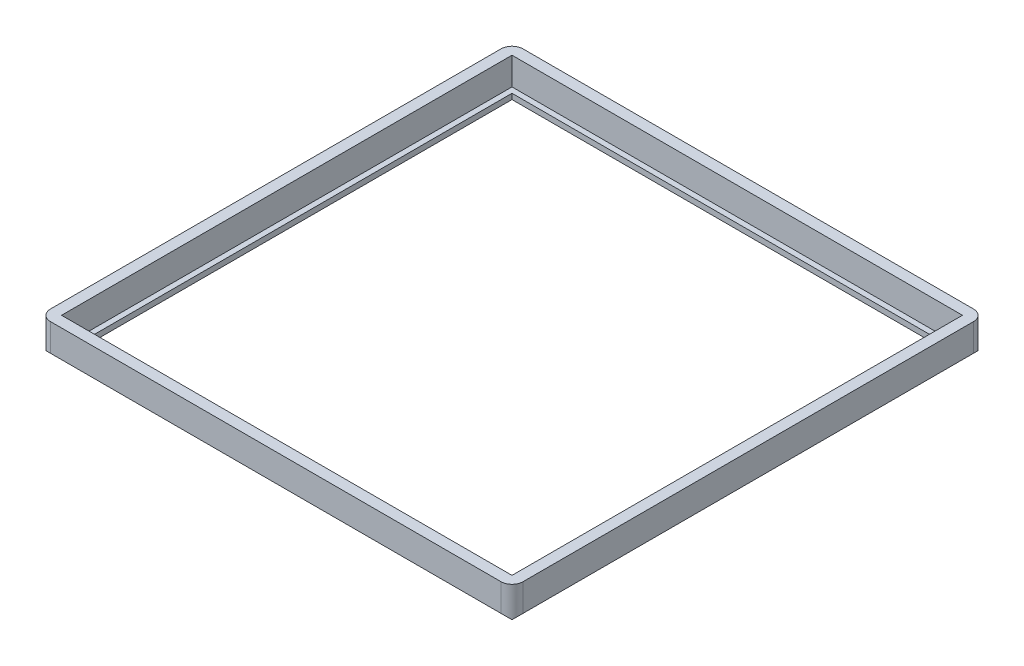
ISO-10303-21;
HEADER;
FILE_DESCRIPTION(('STEP AP214'),'2;1');
FILE_NAME('part.step','',(''),(''),'','','');
FILE_SCHEMA(('AUTOMOTIVE_DESIGN { 1 0 10303 214 1 1 1 1 }'));
ENDSEC;
DATA;
#1=APPLICATION_CONTEXT('core data for automotive mechanical design processes');
#2=APPLICATION_PROTOCOL_DEFINITION('international standard','automotive_design',2000,#1);
#3=PRODUCT_CONTEXT('',#1,'mechanical');
#4=PRODUCT('Part','Part','',(#3));
#5=PRODUCT_RELATED_PRODUCT_CATEGORY('part','',(#4));
#6=PRODUCT_DEFINITION_FORMATION('','',#4);
#7=PRODUCT_DEFINITION_CONTEXT('part definition',#1,'design');
#8=PRODUCT_DEFINITION('design','',#6,#7);
#9=PRODUCT_DEFINITION_SHAPE('','',#8);
#10=(LENGTH_UNIT() NAMED_UNIT(*) SI_UNIT(.MILLI.,.METRE.));
#11=(NAMED_UNIT(*) PLANE_ANGLE_UNIT() SI_UNIT($,.RADIAN.));
#12=(NAMED_UNIT(*) SI_UNIT($,.STERADIAN.) SOLID_ANGLE_UNIT());
#13=UNCERTAINTY_MEASURE_WITH_UNIT(LENGTH_MEASURE(1.E-05),#10,'distance_accuracy_value','');
#14=(GEOMETRIC_REPRESENTATION_CONTEXT(3) GLOBAL_UNCERTAINTY_ASSIGNED_CONTEXT((#13)) GLOBAL_UNIT_ASSIGNED_CONTEXT((#10,
#11,#12)) REPRESENTATION_CONTEXT('',''));
#15=CARTESIAN_POINT('',(0.,0.,0.));
#16=DIRECTION('',(0.,0.,1.));
#17=DIRECTION('',(1.,0.,0.));
#18=AXIS2_PLACEMENT_3D('',#15,#16,#17);
#19=CARTESIAN_POINT('',(-43.,1.,43.));
#20=DIRECTION('',(-1.,0.,0.));
#21=DIRECTION('',(0.,0.,1.));
#22=AXIS2_PLACEMENT_3D('',#19,#20,#21);
#23=PLANE('',#22);
#24=DIRECTION('',(0.,0.,1.));
#25=VECTOR('',#24,1.);
#26=CARTESIAN_POINT('',(-43.,1.,43.));
#27=LINE('',#26,#25);
#28=CARTESIAN_POINT('',(-43.,1.,-41.));
#29=VERTEX_POINT('',#28);
#30=CARTESIAN_POINT('',(-43.,1.,41.));
#31=VERTEX_POINT('',#30);
#32=EDGE_CURVE('E284',#29,#31,#27,.T.);
#33=ORIENTED_EDGE('',*,*,#32,.T.);
#34=DIRECTION('',(0.,-1.,0.));
#35=VECTOR('',#34,1.);
#36=CARTESIAN_POINT('',(-43.,6.,41.));
#37=LINE('',#36,#35);
#38=CARTESIAN_POINT('',(-43.,6.,41.));
#39=VERTEX_POINT('',#38);
#40=EDGE_CURVE('E330',#31,#39,#37,.F.);
#41=ORIENTED_EDGE('',*,*,#40,.T.);
#42=DIRECTION('',(0.,0.,1.));
#43=VECTOR('',#42,1.);
#44=CARTESIAN_POINT('',(-43.,6.,-43.));
#45=LINE('',#44,#43);
#46=CARTESIAN_POINT('',(-43.,6.,-41.));
#47=VERTEX_POINT('',#46);
#48=EDGE_CURVE('E230',#47,#39,#45,.T.);
#49=ORIENTED_EDGE('',*,*,#48,.F.);
#50=DIRECTION('',(0.,-1.,0.));
#51=VECTOR('',#50,1.);
#52=CARTESIAN_POINT('',(-43.,1.,-41.));
#53=LINE('',#52,#51);
#54=EDGE_CURVE('E327',#47,#29,#53,.T.);
#55=ORIENTED_EDGE('',*,*,#54,.T.);
#56=EDGE_LOOP('',(#33,#41,#49,#55));
#57=FACE_BOUND('',#56,.T.);
#58=ADVANCED_FACE('F42',(#57),#23,.T.);
#59=CARTESIAN_POINT('',(-43.,1.,43.));
#60=DIRECTION('',(0.,0.,-1.));
#61=DIRECTION('',(-1.,0.,0.));
#62=AXIS2_PLACEMENT_3D('',#59,#60,#61);
#63=PLANE('',#62);
#64=DIRECTION('',(1.,0.,0.));
#65=VECTOR('',#64,1.);
#66=CARTESIAN_POINT('',(43.,1.,43.));
#67=LINE('',#66,#65);
#68=CARTESIAN_POINT('',(-41.,1.,43.));
#69=VERTEX_POINT('',#68);
#70=CARTESIAN_POINT('',(41.,1.,43.));
#71=VERTEX_POINT('',#70);
#72=EDGE_CURVE('E281',#69,#71,#67,.T.);
#73=ORIENTED_EDGE('',*,*,#72,.T.);
#74=DIRECTION('',(0.,-1.,0.));
#75=VECTOR('',#74,1.);
#76=CARTESIAN_POINT('',(41.,1.,43.));
#77=LINE('',#76,#75);
#78=CARTESIAN_POINT('',(41.,6.,43.));
#79=VERTEX_POINT('',#78);
#80=EDGE_CURVE('E313',#71,#79,#77,.F.);
#81=ORIENTED_EDGE('',*,*,#80,.T.);
#82=DIRECTION('',(1.,0.,0.));
#83=VECTOR('',#82,1.);
#84=CARTESIAN_POINT('',(-43.,6.,43.));
#85=LINE('',#84,#83);
#86=CARTESIAN_POINT('',(-41.,6.,43.));
#87=VERTEX_POINT('',#86);
#88=EDGE_CURVE('E233',#87,#79,#85,.T.);
#89=ORIENTED_EDGE('',*,*,#88,.F.);
#90=DIRECTION('',(0.,-1.,0.));
#91=VECTOR('',#90,1.);
#92=CARTESIAN_POINT('',(-41.,1.,43.));
#93=LINE('',#92,#91);
#94=EDGE_CURVE('E310',#87,#69,#93,.T.);
#95=ORIENTED_EDGE('',*,*,#94,.T.);
#96=EDGE_LOOP('',(#73,#81,#89,#95));
#97=FACE_BOUND('',#96,.T.);
#98=ADVANCED_FACE('F383',(#97),#63,.F.);
#99=CARTESIAN_POINT('',(43.,1.,43.));
#100=DIRECTION('',(-1.,0.,0.));
#101=DIRECTION('',(0.,0.,1.));
#102=AXIS2_PLACEMENT_3D('',#99,#100,#101);
#103=PLANE('',#102);
#104=DIRECTION('',(0.,0.,-1.));
#105=VECTOR('',#104,1.);
#106=CARTESIAN_POINT('',(43.,6.,-43.));
#107=LINE('',#106,#105);
#108=CARTESIAN_POINT('',(43.,6.,41.));
#109=VERTEX_POINT('',#108);
#110=CARTESIAN_POINT('',(43.,6.,-41.));
#111=VERTEX_POINT('',#110);
#112=EDGE_CURVE('E200',#109,#111,#107,.T.);
#113=ORIENTED_EDGE('',*,*,#112,.F.);
#114=DIRECTION('',(0.,-1.,0.));
#115=VECTOR('',#114,1.);
#116=CARTESIAN_POINT('',(43.,1.,41.));
#117=LINE('',#116,#115);
#118=CARTESIAN_POINT('',(43.,1.,41.));
#119=VERTEX_POINT('',#118);
#120=EDGE_CURVE('E299',#109,#119,#117,.T.);
#121=ORIENTED_EDGE('',*,*,#120,.T.);
#122=DIRECTION('',(0.,0.,-1.));
#123=VECTOR('',#122,1.);
#124=CARTESIAN_POINT('',(43.,1.,-43.));
#125=LINE('',#124,#123);
#126=CARTESIAN_POINT('',(43.,1.,-41.));
#127=VERTEX_POINT('',#126);
#128=EDGE_CURVE('E262',#119,#127,#125,.T.);
#129=ORIENTED_EDGE('',*,*,#128,.T.);
#130=DIRECTION('',(0.,-1.,0.));
#131=VECTOR('',#130,1.);
#132=CARTESIAN_POINT('',(43.,6.,-41.));
#133=LINE('',#132,#131);
#134=EDGE_CURVE('E289',#127,#111,#133,.F.);
#135=ORIENTED_EDGE('',*,*,#134,.T.);
#136=EDGE_LOOP('',(#113,#121,#129,#135));
#137=FACE_BOUND('',#136,.T.);
#138=ADVANCED_FACE('F348',(#137),#103,.F.);
#139=CARTESIAN_POINT('',(-43.,1.,-43.));
#140=DIRECTION('',(0.,0.,-1.));
#141=DIRECTION('',(-1.,0.,0.));
#142=AXIS2_PLACEMENT_3D('',#139,#140,#141);
#143=PLANE('',#142);
#144=DIRECTION('',(-1.,0.,0.));
#145=VECTOR('',#144,1.);
#146=CARTESIAN_POINT('',(-43.,1.,-43.));
#147=LINE('',#146,#145);
#148=CARTESIAN_POINT('',(41.,1.,-43.));
#149=VERTEX_POINT('',#148);
#150=CARTESIAN_POINT('',(-41.,1.,-43.));
#151=VERTEX_POINT('',#150);
#152=EDGE_CURVE('E287',#149,#151,#147,.T.);
#153=ORIENTED_EDGE('',*,*,#152,.T.);
#154=DIRECTION('',(0.,-1.,0.));
#155=VECTOR('',#154,1.);
#156=CARTESIAN_POINT('',(-41.,1.,-43.));
#157=LINE('',#156,#155);
#158=CARTESIAN_POINT('',(-41.,6.,-43.));
#159=VERTEX_POINT('',#158);
#160=EDGE_CURVE('E11',#151,#159,#157,.F.);
#161=ORIENTED_EDGE('',*,*,#160,.T.);
#162=DIRECTION('',(-1.,0.,0.));
#163=VECTOR('',#162,1.);
#164=CARTESIAN_POINT('',(-43.,6.,-43.));
#165=LINE('',#164,#163);
#166=CARTESIAN_POINT('',(41.,6.,-43.));
#167=VERTEX_POINT('',#166);
#168=EDGE_CURVE('E227',#167,#159,#165,.T.);
#169=ORIENTED_EDGE('',*,*,#168,.F.);
#170=DIRECTION('',(0.,-1.,0.));
#171=VECTOR('',#170,1.);
#172=CARTESIAN_POINT('',(41.,1.,-43.));
#173=LINE('',#172,#171);
#174=EDGE_CURVE('E50',#167,#149,#173,.T.);
#175=ORIENTED_EDGE('',*,*,#174,.T.);
#176=EDGE_LOOP('',(#153,#161,#169,#175));
#177=FACE_BOUND('',#176,.T.);
#178=ADVANCED_FACE('F335',(#177),#143,.T.);
#179=CARTESIAN_POINT('',(0.,1.,0.));
#180=DIRECTION('',(0.,-1.,0.));
#181=DIRECTION('',(0.,0.,-1.));
#182=AXIS2_PLACEMENT_3D('',#179,#180,#181);
#183=PLANE('',#182);
#184=DIRECTION('',(1.,0.,0.));
#185=VECTOR('',#184,1.);
#186=CARTESIAN_POINT('',(-41.,1.,41.));
#187=LINE('',#186,#185);
#188=CARTESIAN_POINT('',(-41.,1.,41.));
#189=VERTEX_POINT('',#188);
#190=CARTESIAN_POINT('',(41.,1.,41.));
#191=VERTEX_POINT('',#190);
#192=EDGE_CURVE('E193',#189,#191,#187,.T.);
#193=ORIENTED_EDGE('',*,*,#192,.T.);
#194=DIRECTION('',(0.,0.,-1.));
#195=VECTOR('',#194,1.);
#196=CARTESIAN_POINT('',(41.,1.,-41.));
#197=LINE('',#196,#195);
#198=CARTESIAN_POINT('',(41.,1.,-41.));
#199=VERTEX_POINT('',#198);
#200=EDGE_CURVE('E212',#191,#199,#197,.T.);
#201=ORIENTED_EDGE('',*,*,#200,.T.);
#202=DIRECTION('',(-1.,0.,0.));
#203=VECTOR('',#202,1.);
#204=CARTESIAN_POINT('',(-41.,1.,-41.));
#205=LINE('',#204,#203);
#206=CARTESIAN_POINT('',(-41.,1.,-41.));
#207=VERTEX_POINT('',#206);
#208=EDGE_CURVE('E199',#199,#207,#205,.T.);
#209=ORIENTED_EDGE('',*,*,#208,.T.);
#210=DIRECTION('',(0.,0.,1.));
#211=VECTOR('',#210,1.);
#212=CARTESIAN_POINT('',(-41.,1.,-41.));
#213=LINE('',#212,#211);
#214=EDGE_CURVE('E216',#207,#189,#213,.T.);
#215=ORIENTED_EDGE('',*,*,#214,.T.);
#216=EDGE_LOOP('',(#193,#201,#209,#215));
#217=FACE_BOUND('',#216,.T.);
#218=DIRECTION('',(1.,0.,0.));
#219=VECTOR('',#218,1.);
#220=CARTESIAN_POINT('',(-40.,1.,-40.));
#221=LINE('',#220,#219);
#222=CARTESIAN_POINT('',(-40.,1.,-40.));
#223=VERTEX_POINT('',#222);
#224=CARTESIAN_POINT('',(40.,1.,-40.));
#225=VERTEX_POINT('',#224);
#226=EDGE_CURVE('E247',#223,#225,#221,.T.);
#227=ORIENTED_EDGE('',*,*,#226,.T.);
#228=DIRECTION('',(0.,0.,1.));
#229=VECTOR('',#228,1.);
#230=CARTESIAN_POINT('',(40.,1.,40.));
#231=LINE('',#230,#229);
#232=CARTESIAN_POINT('',(40.,1.,40.));
#233=VERTEX_POINT('',#232);
#234=EDGE_CURVE('E237',#225,#233,#231,.T.);
#235=ORIENTED_EDGE('',*,*,#234,.T.);
#236=DIRECTION('',(-1.,0.,0.));
#237=VECTOR('',#236,1.);
#238=CARTESIAN_POINT('',(-40.,1.,40.));
#239=LINE('',#238,#237);
#240=CARTESIAN_POINT('',(-40.,1.,40.));
#241=VERTEX_POINT('',#240);
#242=EDGE_CURVE('E240',#233,#241,#239,.T.);
#243=ORIENTED_EDGE('',*,*,#242,.T.);
#244=DIRECTION('',(0.,0.,-1.));
#245=VECTOR('',#244,1.);
#246=CARTESIAN_POINT('',(-40.,1.,40.));
#247=LINE('',#246,#245);
#248=EDGE_CURVE('E244',#241,#223,#247,.T.);
#249=ORIENTED_EDGE('',*,*,#248,.T.);
#250=EDGE_LOOP('',(#227,#235,#243,#249));
#251=FACE_BOUND('',#250,.T.);
#252=ADVANCED_FACE('F516',(#217,#251),#183,.F.);
#253=CARTESIAN_POINT('',(0.,0.,0.));
#254=DIRECTION('',(0.,-1.,0.));
#255=DIRECTION('',(0.,0.,-1.));
#256=AXIS2_PLACEMENT_3D('',#253,#254,#255);
#257=PLANE('',#256);
#258=DIRECTION('',(1.,0.,0.));
#259=VECTOR('',#258,1.);
#260=CARTESIAN_POINT('',(0.,0.,-42.));
#261=LINE('',#260,#259);
#262=CARTESIAN_POINT('',(-42.,0.,-42.));
#263=VERTEX_POINT('',#262);
#264=CARTESIAN_POINT('',(42.,0.,-42.));
#265=VERTEX_POINT('',#264);
#266=EDGE_CURVE('E271',#263,#265,#261,.T.);
#267=ORIENTED_EDGE('',*,*,#266,.T.);
#268=DIRECTION('',(0.,0.,1.));
#269=VECTOR('',#268,1.);
#270=CARTESIAN_POINT('',(42.,0.,43.));
#271=LINE('',#270,#269);
#272=CARTESIAN_POINT('',(42.,0.,42.));
#273=VERTEX_POINT('',#272);
#274=EDGE_CURVE('E278',#265,#273,#271,.T.);
#275=ORIENTED_EDGE('',*,*,#274,.T.);
#276=DIRECTION('',(-1.,0.,0.));
#277=VECTOR('',#276,1.);
#278=CARTESIAN_POINT('',(-43.,0.,42.));
#279=LINE('',#278,#277);
#280=CARTESIAN_POINT('',(-42.,0.,42.));
#281=VERTEX_POINT('',#280);
#282=EDGE_CURVE('E275',#273,#281,#279,.T.);
#283=ORIENTED_EDGE('',*,*,#282,.T.);
#284=DIRECTION('',(0.,0.,-1.));
#285=VECTOR('',#284,1.);
#286=CARTESIAN_POINT('',(-42.,0.,0.));
#287=LINE('',#286,#285);
#288=EDGE_CURVE('E273',#281,#263,#287,.T.);
#289=ORIENTED_EDGE('',*,*,#288,.T.);
#290=EDGE_LOOP('',(#267,#275,#283,#289));
#291=FACE_BOUND('',#290,.T.);
#292=DIRECTION('',(0.,0.,1.));
#293=VECTOR('',#292,1.);
#294=CARTESIAN_POINT('',(40.,0.,40.));
#295=LINE('',#294,#293);
#296=CARTESIAN_POINT('',(40.,0.,-40.));
#297=VERTEX_POINT('',#296);
#298=CARTESIAN_POINT('',(40.,0.,40.));
#299=VERTEX_POINT('',#298);
#300=EDGE_CURVE('E236',#297,#299,#295,.T.);
#301=ORIENTED_EDGE('',*,*,#300,.F.);
#302=DIRECTION('',(1.,0.,0.));
#303=VECTOR('',#302,1.);
#304=CARTESIAN_POINT('',(-40.,0.,-40.));
#305=LINE('',#304,#303);
#306=CARTESIAN_POINT('',(-40.,0.,-40.));
#307=VERTEX_POINT('',#306);
#308=EDGE_CURVE('E241',#307,#297,#305,.T.);
#309=ORIENTED_EDGE('',*,*,#308,.F.);
#310=DIRECTION('',(0.,0.,-1.));
#311=VECTOR('',#310,1.);
#312=CARTESIAN_POINT('',(-40.,0.,40.));
#313=LINE('',#312,#311);
#314=CARTESIAN_POINT('',(-40.,0.,40.));
#315=VERTEX_POINT('',#314);
#316=EDGE_CURVE('E255',#315,#307,#313,.T.);
#317=ORIENTED_EDGE('',*,*,#316,.F.);
#318=DIRECTION('',(-1.,0.,0.));
#319=VECTOR('',#318,1.);
#320=CARTESIAN_POINT('',(-40.,0.,40.));
#321=LINE('',#320,#319);
#322=EDGE_CURVE('E252',#299,#315,#321,.T.);
#323=ORIENTED_EDGE('',*,*,#322,.F.);
#324=EDGE_LOOP('',(#301,#309,#317,#323));
#325=FACE_BOUND('',#324,.T.);
#326=ADVANCED_FACE('F365',(#291,#325),#257,.T.);
#327=CARTESIAN_POINT('',(40.,1.,40.));
#328=DIRECTION('',(1.,0.,0.));
#329=DIRECTION('',(0.,0.,-1.));
#330=AXIS2_PLACEMENT_3D('',#327,#328,#329);
#331=PLANE('',#330);
#332=ORIENTED_EDGE('',*,*,#300,.T.);
#333=DIRECTION('',(0.,-1.,0.));
#334=VECTOR('',#333,1.);
#335=CARTESIAN_POINT('',(40.,1.,40.));
#336=LINE('',#335,#334);
#337=EDGE_CURVE('E250',#233,#299,#336,.T.);
#338=ORIENTED_EDGE('',*,*,#337,.F.);
#339=ORIENTED_EDGE('',*,*,#234,.F.);
#340=DIRECTION('',(0.,-1.,0.));
#341=VECTOR('',#340,1.);
#342=CARTESIAN_POINT('',(40.,1.,-40.));
#343=LINE('',#342,#341);
#344=EDGE_CURVE('E260',#225,#297,#343,.T.);
#345=ORIENTED_EDGE('',*,*,#344,.T.);
#346=EDGE_LOOP('',(#332,#338,#339,#345));
#347=FACE_BOUND('',#346,.T.);
#348=ADVANCED_FACE('F568',(#347),#331,.F.);
#349=CARTESIAN_POINT('',(-40.,1.,-40.));
#350=DIRECTION('',(0.,0.,-1.));
#351=DIRECTION('',(-1.,0.,0.));
#352=AXIS2_PLACEMENT_3D('',#349,#350,#351);
#353=PLANE('',#352);
#354=ORIENTED_EDGE('',*,*,#308,.T.);
#355=ORIENTED_EDGE('',*,*,#344,.F.);
#356=ORIENTED_EDGE('',*,*,#226,.F.);
#357=DIRECTION('',(0.,-1.,0.));
#358=VECTOR('',#357,1.);
#359=CARTESIAN_POINT('',(-40.,1.,-40.));
#360=LINE('',#359,#358);
#361=EDGE_CURVE('E263',#223,#307,#360,.T.);
#362=ORIENTED_EDGE('',*,*,#361,.T.);
#363=EDGE_LOOP('',(#354,#355,#356,#362));
#364=FACE_BOUND('',#363,.T.);
#365=ADVANCED_FACE('F559',(#364),#353,.F.);
#366=CARTESIAN_POINT('',(-40.,1.,40.));
#367=DIRECTION('',(-1.,0.,0.));
#368=DIRECTION('',(0.,0.,1.));
#369=AXIS2_PLACEMENT_3D('',#366,#367,#368);
#370=PLANE('',#369);
#371=ORIENTED_EDGE('',*,*,#316,.T.);
#372=ORIENTED_EDGE('',*,*,#361,.F.);
#373=ORIENTED_EDGE('',*,*,#248,.F.);
#374=DIRECTION('',(0.,-1.,0.));
#375=VECTOR('',#374,1.);
#376=CARTESIAN_POINT('',(-40.,1.,40.));
#377=LINE('',#376,#375);
#378=EDGE_CURVE('E265',#241,#315,#377,.T.);
#379=ORIENTED_EDGE('',*,*,#378,.T.);
#380=EDGE_LOOP('',(#371,#372,#373,#379));
#381=FACE_BOUND('',#380,.T.);
#382=ADVANCED_FACE('F550',(#381),#370,.F.);
#383=CARTESIAN_POINT('',(-40.,1.,40.));
#384=DIRECTION('',(0.,0.,1.));
#385=DIRECTION('',(1.,0.,0.));
#386=AXIS2_PLACEMENT_3D('',#383,#384,#385);
#387=PLANE('',#386);
#388=ORIENTED_EDGE('',*,*,#322,.T.);
#389=ORIENTED_EDGE('',*,*,#378,.F.);
#390=ORIENTED_EDGE('',*,*,#242,.F.);
#391=ORIENTED_EDGE('',*,*,#337,.T.);
#392=EDGE_LOOP('',(#388,#389,#390,#391));
#393=FACE_BOUND('',#392,.T.);
#394=ADVANCED_FACE('F507',(#393),#387,.F.);
#395=CARTESIAN_POINT('',(0.,6.,0.));
#396=DIRECTION('',(0.,1.,0.));
#397=DIRECTION('',(0.,0.,1.));
#398=AXIS2_PLACEMENT_3D('',#395,#396,#397);
#399=PLANE('',#398);
#400=ORIENTED_EDGE('',*,*,#88,.T.);
#401=CARTESIAN_POINT('',(41.,6.,41.));
#402=DIRECTION('',(0.,1.,0.));
#403=DIRECTION('',(0.,0.,1.));
#404=AXIS2_PLACEMENT_3D('',#401,#402,#403);
#405=CIRCLE('',#404,2.);
#406=EDGE_CURVE('E321',#79,#109,#405,.T.);
#407=ORIENTED_EDGE('',*,*,#406,.T.);
#408=ORIENTED_EDGE('',*,*,#112,.T.);
#409=CARTESIAN_POINT('',(41.,6.,-41.));
#410=DIRECTION('',(0.,1.,0.));
#411=DIRECTION('',(0.,0.,1.));
#412=AXIS2_PLACEMENT_3D('',#409,#410,#411);
#413=CIRCLE('',#412,2.);
#414=EDGE_CURVE('E315',#111,#167,#413,.T.);
#415=ORIENTED_EDGE('',*,*,#414,.T.);
#416=ORIENTED_EDGE('',*,*,#168,.T.);
#417=CARTESIAN_POINT('',(-41.,6.,-41.));
#418=DIRECTION('',(0.,1.,0.));
#419=DIRECTION('',(0.,0.,1.));
#420=AXIS2_PLACEMENT_3D('',#417,#418,#419);
#421=CIRCLE('',#420,2.);
#422=EDGE_CURVE('E317',#159,#47,#421,.T.);
#423=ORIENTED_EDGE('',*,*,#422,.T.);
#424=ORIENTED_EDGE('',*,*,#48,.T.);
#425=CARTESIAN_POINT('',(-41.,6.,41.));
#426=DIRECTION('',(0.,1.,0.));
#427=DIRECTION('',(0.,0.,1.));
#428=AXIS2_PLACEMENT_3D('',#425,#426,#427);
#429=CIRCLE('',#428,2.);
#430=EDGE_CURVE('E319',#39,#87,#429,.T.);
#431=ORIENTED_EDGE('',*,*,#430,.T.);
#432=EDGE_LOOP('',(#400,#407,#408,#415,#416,#423,#424,#431));
#433=FACE_BOUND('',#432,.T.);
#434=DIRECTION('',(-1.,0.,0.));
#435=VECTOR('',#434,1.);
#436=CARTESIAN_POINT('',(-41.,6.,-41.));
#437=LINE('',#436,#435);
#438=CARTESIAN_POINT('',(41.,6.,-41.));
#439=VERTEX_POINT('',#438);
#440=CARTESIAN_POINT('',(-41.,6.,-41.));
#441=VERTEX_POINT('',#440);
#442=EDGE_CURVE('E192',#439,#441,#437,.T.);
#443=ORIENTED_EDGE('',*,*,#442,.F.);
#444=DIRECTION('',(0.,0.,-1.));
#445=VECTOR('',#444,1.);
#446=CARTESIAN_POINT('',(41.,6.,-41.));
#447=LINE('',#446,#445);
#448=CARTESIAN_POINT('',(41.,6.,41.));
#449=VERTEX_POINT('',#448);
#450=EDGE_CURVE('E182',#449,#439,#447,.T.);
#451=ORIENTED_EDGE('',*,*,#450,.F.);
#452=DIRECTION('',(1.,0.,0.));
#453=VECTOR('',#452,1.);
#454=CARTESIAN_POINT('',(-41.,6.,41.));
#455=LINE('',#454,#453);
#456=CARTESIAN_POINT('',(-41.,6.,41.));
#457=VERTEX_POINT('',#456);
#458=EDGE_CURVE('E208',#457,#449,#455,.T.);
#459=ORIENTED_EDGE('',*,*,#458,.F.);
#460=DIRECTION('',(0.,0.,1.));
#461=VECTOR('',#460,1.);
#462=CARTESIAN_POINT('',(-41.,6.,-41.));
#463=LINE('',#462,#461);
#464=EDGE_CURVE('E206',#441,#457,#463,.T.);
#465=ORIENTED_EDGE('',*,*,#464,.F.);
#466=EDGE_LOOP('',(#443,#451,#459,#465));
#467=FACE_BOUND('',#466,.T.);
#468=ADVANCED_FACE('F204',(#433,#467),#399,.T.);
#469=CARTESIAN_POINT('',(41.,6.,-41.));
#470=DIRECTION('',(-1.,0.,0.));
#471=DIRECTION('',(0.,0.,1.));
#472=AXIS2_PLACEMENT_3D('',#469,#470,#471);
#473=PLANE('',#472);
#474=ORIENTED_EDGE('',*,*,#200,.F.);
#475=DIRECTION('',(0.,-1.,0.));
#476=VECTOR('',#475,1.);
#477=CARTESIAN_POINT('',(41.,6.,41.));
#478=LINE('',#477,#476);
#479=EDGE_CURVE('E188',#449,#191,#478,.T.);
#480=ORIENTED_EDGE('',*,*,#479,.F.);
#481=ORIENTED_EDGE('',*,*,#450,.T.);
#482=DIRECTION('',(0.,-1.,0.));
#483=VECTOR('',#482,1.);
#484=CARTESIAN_POINT('',(41.,6.,-41.));
#485=LINE('',#484,#483);
#486=EDGE_CURVE('E186',#439,#199,#485,.T.);
#487=ORIENTED_EDGE('',*,*,#486,.T.);
#488=EDGE_LOOP('',(#474,#480,#481,#487));
#489=FACE_BOUND('',#488,.T.);
#490=ADVANCED_FACE('F185',(#489),#473,.T.);
#491=CARTESIAN_POINT('',(-41.,6.,-41.));
#492=DIRECTION('',(0.,0.,1.));
#493=DIRECTION('',(1.,0.,0.));
#494=AXIS2_PLACEMENT_3D('',#491,#492,#493);
#495=PLANE('',#494);
#496=ORIENTED_EDGE('',*,*,#208,.F.);
#497=ORIENTED_EDGE('',*,*,#486,.F.);
#498=ORIENTED_EDGE('',*,*,#442,.T.);
#499=DIRECTION('',(0.,-1.,0.));
#500=VECTOR('',#499,1.);
#501=CARTESIAN_POINT('',(-41.,6.,-41.));
#502=LINE('',#501,#500);
#503=EDGE_CURVE('E201',#441,#207,#502,.T.);
#504=ORIENTED_EDGE('',*,*,#503,.T.);
#505=EDGE_LOOP('',(#496,#497,#498,#504));
#506=FACE_BOUND('',#505,.T.);
#507=ADVANCED_FACE('F196',(#506),#495,.T.);
#508=CARTESIAN_POINT('',(-41.,6.,-41.));
#509=DIRECTION('',(1.,0.,0.));
#510=DIRECTION('',(0.,0.,-1.));
#511=AXIS2_PLACEMENT_3D('',#508,#509,#510);
#512=PLANE('',#511);
#513=ORIENTED_EDGE('',*,*,#214,.F.);
#514=ORIENTED_EDGE('',*,*,#503,.F.);
#515=ORIENTED_EDGE('',*,*,#464,.T.);
#516=DIRECTION('',(0.,-1.,0.));
#517=VECTOR('',#516,1.);
#518=CARTESIAN_POINT('',(-41.,6.,41.));
#519=LINE('',#518,#517);
#520=EDGE_CURVE('E222',#457,#189,#519,.T.);
#521=ORIENTED_EDGE('',*,*,#520,.T.);
#522=EDGE_LOOP('',(#513,#514,#515,#521));
#523=FACE_BOUND('',#522,.T.);
#524=ADVANCED_FACE('F393',(#523),#512,.T.);
#525=CARTESIAN_POINT('',(-41.,6.,41.));
#526=DIRECTION('',(0.,0.,-1.));
#527=DIRECTION('',(-1.,0.,0.));
#528=AXIS2_PLACEMENT_3D('',#525,#526,#527);
#529=PLANE('',#528);
#530=ORIENTED_EDGE('',*,*,#192,.F.);
#531=ORIENTED_EDGE('',*,*,#520,.F.);
#532=ORIENTED_EDGE('',*,*,#458,.T.);
#533=ORIENTED_EDGE('',*,*,#479,.T.);
#534=EDGE_LOOP('',(#530,#531,#532,#533));
#535=FACE_BOUND('',#534,.T.);
#536=ADVANCED_FACE('F386',(#535),#529,.T.);
#537=CARTESIAN_POINT('',(-42.,0.,0.));
#538=DIRECTION('',(0.707106781186552,0.707106781186543,0.));
#539=DIRECTION('',(0.,0.,-1.));
#540=AXIS2_PLACEMENT_3D('',#537,#538,#539);
#541=PLANE('',#540);
#542=DIRECTION('',(0.577350269189623,-0.577350269189631,-0.577350269189623));
#543=VECTOR('',#542,1.);
#544=CARTESIAN_POINT('',(-28.0000000000001,-14.0000000000001,28.0000000000001));
#545=LINE('',#544,#543);
#546=CARTESIAN_POINT('',(-42.4142135623731,0.414213562373082,42.4142135623731));
#547=VERTEX_POINT('',#546);
#548=EDGE_CURVE('E214',#547,#281,#545,.T.);
#549=ORIENTED_EDGE('',*,*,#548,.F.);
#550=CARTESIAN_POINT('',(-41.,-1.00000000000003,41.));
#551=DIRECTION('',(0.707106781186552,0.707106781186543,0.));
#552=DIRECTION('',(-0.707106781186543,0.707106781186552,0.));
#553=AXIS2_PLACEMENT_3D('',#550,#551,#552);
#554=ELLIPSE('',#553,2.82842712474621,2.);
#555=EDGE_CURVE('E325',#547,#31,#554,.F.);
#556=ORIENTED_EDGE('',*,*,#555,.T.);
#557=ORIENTED_EDGE('',*,*,#32,.F.);
#558=CARTESIAN_POINT('',(-41.,-1.00000000000003,-41.));
#559=DIRECTION('',(0.707106781186552,0.707106781186543,0.));
#560=DIRECTION('',(0.707106781186543,-0.707106781186552,0.));
#561=AXIS2_PLACEMENT_3D('',#558,#559,#560);
#562=ELLIPSE('',#561,2.82842712474621,2.);
#563=CARTESIAN_POINT('',(-42.4142135623731,0.414213562373082,-42.4142135623731));
#564=VERTEX_POINT('',#563);
#565=EDGE_CURVE('E323',#29,#564,#562,.F.);
#566=ORIENTED_EDGE('',*,*,#565,.T.);
#567=DIRECTION('',(-0.577350269189623,0.577350269189631,-0.577350269189623));
#568=VECTOR('',#567,1.);
#569=CARTESIAN_POINT('',(-28.0000000000001,-14.0000000000001,-28.0000000000001));
#570=LINE('',#569,#568);
#571=EDGE_CURVE('E295',#263,#564,#570,.T.);
#572=ORIENTED_EDGE('',*,*,#571,.F.);
#573=ORIENTED_EDGE('',*,*,#288,.F.);
#574=EDGE_LOOP('',(#549,#556,#557,#566,#572,#573));
#575=FACE_BOUND('',#574,.T.);
#576=ADVANCED_FACE('F384',(#575),#541,.F.);
#577=CARTESIAN_POINT('',(-43.,1.,43.));
#578=DIRECTION('',(0.,-0.707106781186543,0.707106781186552));
#579=DIRECTION('',(-1.,0.,0.));
#580=AXIS2_PLACEMENT_3D('',#577,#578,#579);
#581=PLANE('',#580);
#582=DIRECTION('',(0.577350269189623,0.577350269189631,0.577350269189623));
#583=VECTOR('',#582,1.);
#584=CARTESIAN_POINT('',(14.3333333333336,-27.6666666666668,14.3333333333336));
#585=LINE('',#584,#583);
#586=CARTESIAN_POINT('',(42.4142135623731,0.414213562373086,42.4142135623731));
#587=VERTEX_POINT('',#586);
#588=EDGE_CURVE('E293',#587,#273,#585,.F.);
#589=ORIENTED_EDGE('',*,*,#588,.F.);
#590=CARTESIAN_POINT('',(41.,-1.00000000000003,41.));
#591=DIRECTION('',(0.,-0.707106781186543,0.707106781186552));
#592=DIRECTION('',(0.,-0.707106781186552,-0.707106781186543));
#593=AXIS2_PLACEMENT_3D('',#590,#591,#592);
#594=ELLIPSE('',#593,2.82842712474621,2.);
#595=EDGE_CURVE('E308',#587,#71,#594,.T.);
#596=ORIENTED_EDGE('',*,*,#595,.T.);
#597=ORIENTED_EDGE('',*,*,#72,.F.);
#598=CARTESIAN_POINT('',(-41.,-1.00000000000003,41.));
#599=DIRECTION('',(0.,-0.707106781186543,0.707106781186552));
#600=DIRECTION('',(0.,0.707106781186552,0.707106781186543));
#601=AXIS2_PLACEMENT_3D('',#598,#599,#600);
#602=ELLIPSE('',#601,2.82842712474621,2.);
#603=EDGE_CURVE('E306',#69,#547,#602,.T.);
#604=ORIENTED_EDGE('',*,*,#603,.T.);
#605=ORIENTED_EDGE('',*,*,#548,.T.);
#606=ORIENTED_EDGE('',*,*,#282,.F.);
#607=EDGE_LOOP('',(#589,#596,#597,#604,#605,#606));
#608=FACE_BOUND('',#607,.T.);
#609=ADVANCED_FACE('F360',(#608),#581,.T.);
#610=CARTESIAN_POINT('',(0.,0.,-42.));
#611=DIRECTION('',(0.,0.707106781186543,0.707106781186552));
#612=DIRECTION('',(1.,0.,0.));
#613=AXIS2_PLACEMENT_3D('',#610,#611,#612);
#614=PLANE('',#613);
#615=ORIENTED_EDGE('',*,*,#571,.T.);
#616=CARTESIAN_POINT('',(-41.,-1.00000000000003,-41.));
#617=DIRECTION('',(0.,0.707106781186543,0.707106781186552));
#618=DIRECTION('',(0.,-0.707106781186552,0.707106781186543));
#619=AXIS2_PLACEMENT_3D('',#616,#617,#618);
#620=ELLIPSE('',#619,2.82842712474621,2.);
#621=EDGE_CURVE('E57',#564,#151,#620,.F.);
#622=ORIENTED_EDGE('',*,*,#621,.T.);
#623=ORIENTED_EDGE('',*,*,#152,.F.);
#624=CARTESIAN_POINT('',(41.,-1.00000000000003,-41.));
#625=DIRECTION('',(0.,0.707106781186543,0.707106781186552));
#626=DIRECTION('',(0.,0.707106781186552,-0.707106781186543));
#627=AXIS2_PLACEMENT_3D('',#624,#625,#626);
#628=ELLIPSE('',#627,2.82842712474621,2.);
#629=CARTESIAN_POINT('',(42.4142135623731,0.414213562373082,-42.4142135623731));
#630=VERTEX_POINT('',#629);
#631=EDGE_CURVE('E65',#149,#630,#628,.F.);
#632=ORIENTED_EDGE('',*,*,#631,.T.);
#633=DIRECTION('',(0.577350269189623,0.577350269189631,-0.577350269189623));
#634=VECTOR('',#633,1.);
#635=CARTESIAN_POINT('',(28.0000000000001,-14.0000000000001,-28.0000000000001));
#636=LINE('',#635,#634);
#637=EDGE_CURVE('E290',#265,#630,#636,.T.);
#638=ORIENTED_EDGE('',*,*,#637,.F.);
#639=ORIENTED_EDGE('',*,*,#266,.F.);
#640=EDGE_LOOP('',(#615,#622,#623,#632,#638,#639));
#641=FACE_BOUND('',#640,.T.);
#642=ADVANCED_FACE('F338',(#641),#614,.F.);
#643=CARTESIAN_POINT('',(43.,1.,43.));
#644=DIRECTION('',(0.707106781186552,-0.707106781186543,0.));
#645=DIRECTION('',(0.,0.,1.));
#646=AXIS2_PLACEMENT_3D('',#643,#644,#645);
#647=PLANE('',#646);
#648=ORIENTED_EDGE('',*,*,#128,.F.);
#649=CARTESIAN_POINT('',(41.,-1.00000000000003,41.));
#650=DIRECTION('',(0.707106781186552,-0.707106781186543,0.));
#651=DIRECTION('',(-0.707106781186543,-0.707106781186552,0.));
#652=AXIS2_PLACEMENT_3D('',#649,#650,#651);
#653=ELLIPSE('',#652,2.82842712474621,2.);
#654=EDGE_CURVE('E304',#119,#587,#653,.T.);
#655=ORIENTED_EDGE('',*,*,#654,.T.);
#656=ORIENTED_EDGE('',*,*,#588,.T.);
#657=ORIENTED_EDGE('',*,*,#274,.F.);
#658=ORIENTED_EDGE('',*,*,#637,.T.);
#659=CARTESIAN_POINT('',(41.,-1.00000000000003,-41.));
#660=DIRECTION('',(0.707106781186552,-0.707106781186543,0.));
#661=DIRECTION('',(0.707106781186543,0.707106781186552,0.));
#662=AXIS2_PLACEMENT_3D('',#659,#660,#661);
#663=ELLIPSE('',#662,2.82842712474621,2.);
#664=EDGE_CURVE('E302',#630,#127,#663,.T.);
#665=ORIENTED_EDGE('',*,*,#664,.T.);
#666=EDGE_LOOP('',(#648,#655,#656,#657,#658,#665));
#667=FACE_BOUND('',#666,.T.);
#668=ADVANCED_FACE('F344',(#667),#647,.T.);
#669=CARTESIAN_POINT('',(41.,1.,41.));
#670=DIRECTION('',(0.,-1.,0.));
#671=DIRECTION('',(0.,0.,-1.));
#672=AXIS2_PLACEMENT_3D('',#669,#670,#671);
#673=CYLINDRICAL_SURFACE('',#672,2.);
#674=ORIENTED_EDGE('',*,*,#406,.F.);
#675=ORIENTED_EDGE('',*,*,#80,.F.);
#676=ORIENTED_EDGE('',*,*,#595,.F.);
#677=ORIENTED_EDGE('',*,*,#654,.F.);
#678=ORIENTED_EDGE('',*,*,#120,.F.);
#679=EDGE_LOOP('',(#674,#675,#676,#677,#678));
#680=FACE_BOUND('',#679,.T.);
#681=ADVANCED_FACE('F355',(#680),#673,.T.);
#682=CARTESIAN_POINT('',(-41.,1.,41.));
#683=DIRECTION('',(0.,1.,0.));
#684=DIRECTION('',(0.,0.,1.));
#685=AXIS2_PLACEMENT_3D('',#682,#683,#684);
#686=CYLINDRICAL_SURFACE('',#685,2.);
#687=ORIENTED_EDGE('',*,*,#430,.F.);
#688=ORIENTED_EDGE('',*,*,#40,.F.);
#689=ORIENTED_EDGE('',*,*,#555,.F.);
#690=ORIENTED_EDGE('',*,*,#603,.F.);
#691=ORIENTED_EDGE('',*,*,#94,.F.);
#692=EDGE_LOOP('',(#687,#688,#689,#690,#691));
#693=FACE_BOUND('',#692,.T.);
#694=ADVANCED_FACE('F380',(#693),#686,.T.);
#695=CARTESIAN_POINT('',(-41.,1.,-41.));
#696=DIRECTION('',(0.,-1.,0.));
#697=DIRECTION('',(0.,0.,-1.));
#698=AXIS2_PLACEMENT_3D('',#695,#696,#697);
#699=CYLINDRICAL_SURFACE('',#698,2.);
#700=ORIENTED_EDGE('',*,*,#422,.F.);
#701=ORIENTED_EDGE('',*,*,#160,.F.);
#702=ORIENTED_EDGE('',*,*,#621,.F.);
#703=ORIENTED_EDGE('',*,*,#565,.F.);
#704=ORIENTED_EDGE('',*,*,#54,.F.);
#705=EDGE_LOOP('',(#700,#701,#702,#703,#704));
#706=FACE_BOUND('',#705,.T.);
#707=ADVANCED_FACE('F371',(#706),#699,.T.);
#708=CARTESIAN_POINT('',(41.,1.,-41.));
#709=DIRECTION('',(0.,1.,0.));
#710=DIRECTION('',(0.,0.,1.));
#711=AXIS2_PLACEMENT_3D('',#708,#709,#710);
#712=CYLINDRICAL_SURFACE('',#711,2.);
#713=ORIENTED_EDGE('',*,*,#414,.F.);
#714=ORIENTED_EDGE('',*,*,#134,.F.);
#715=ORIENTED_EDGE('',*,*,#664,.F.);
#716=ORIENTED_EDGE('',*,*,#631,.F.);
#717=ORIENTED_EDGE('',*,*,#174,.F.);
#718=EDGE_LOOP('',(#713,#714,#715,#716,#717));
#719=FACE_BOUND('',#718,.T.);
#720=ADVANCED_FACE('F44',(#719),#712,.T.);
#721=CLOSED_SHELL('',(#58,#98,#138,#178,#252,#326,#348,#365,#382,#394,#468,#490,#507,#524,#536,
#576,#609,#642,#668,#681,#694,#707,#720));
#722=MANIFOLD_SOLID_BREP('B2',#721);
#723=ADVANCED_BREP_SHAPE_REPRESENTATION('',(#18,#722),#14);
#724=SHAPE_DEFINITION_REPRESENTATION(#9,#723);
ENDSEC;
END-ISO-10303-21;
